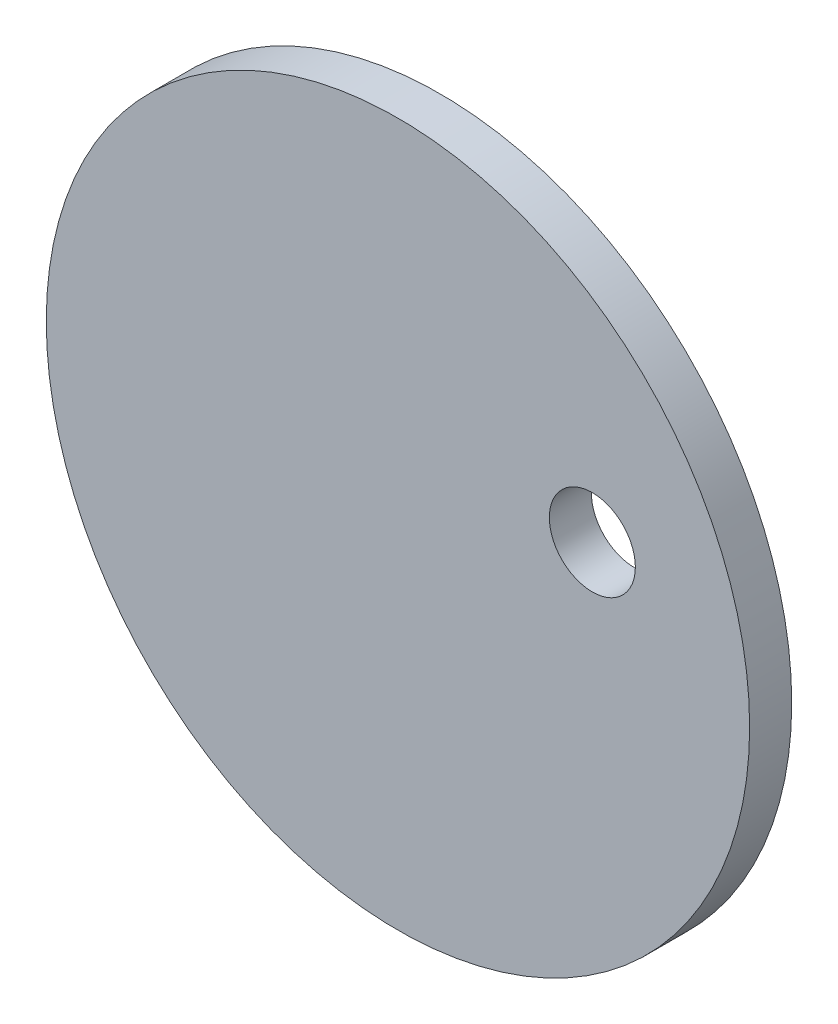
ISO-10303-21;
HEADER;
FILE_DESCRIPTION(('STEP AP214'),'2;1');
FILE_NAME('part.step','',(''),(''),'','','');
FILE_SCHEMA(('AUTOMOTIVE_DESIGN { 1 0 10303 214 1 1 1 1 }'));
ENDSEC;
DATA;
#1=APPLICATION_CONTEXT('core data for automotive mechanical design processes');
#2=APPLICATION_PROTOCOL_DEFINITION('international standard','automotive_design',2000,#1);
#3=PRODUCT_CONTEXT('',#1,'mechanical');
#4=PRODUCT('Part','Part','',(#3));
#5=PRODUCT_RELATED_PRODUCT_CATEGORY('part','',(#4));
#6=PRODUCT_DEFINITION_FORMATION('','',#4);
#7=PRODUCT_DEFINITION_CONTEXT('part definition',#1,'design');
#8=PRODUCT_DEFINITION('design','',#6,#7);
#9=PRODUCT_DEFINITION_SHAPE('','',#8);
#10=(LENGTH_UNIT() NAMED_UNIT(*) SI_UNIT(.MILLI.,.METRE.));
#11=(NAMED_UNIT(*) PLANE_ANGLE_UNIT() SI_UNIT($,.RADIAN.));
#12=(NAMED_UNIT(*) SI_UNIT($,.STERADIAN.) SOLID_ANGLE_UNIT());
#13=UNCERTAINTY_MEASURE_WITH_UNIT(LENGTH_MEASURE(1.E-05),#10,'distance_accuracy_value','');
#14=(GEOMETRIC_REPRESENTATION_CONTEXT(3) GLOBAL_UNCERTAINTY_ASSIGNED_CONTEXT((#13)) GLOBAL_UNIT_ASSIGNED_CONTEXT((#10,
#11,#12)) REPRESENTATION_CONTEXT('',''));
#15=CARTESIAN_POINT('',(0.,0.,0.));
#16=DIRECTION('',(0.,0.,1.));
#17=DIRECTION('',(1.,0.,0.));
#18=AXIS2_PLACEMENT_3D('',#15,#16,#17);
#19=CARTESIAN_POINT('',(0.,0.,-9.14399999999999));
#20=DIRECTION('',(0.,0.,1.));
#21=DIRECTION('',(1.,0.,0.));
#22=AXIS2_PLACEMENT_3D('',#19,#20,#21);
#23=CYLINDRICAL_SURFACE('',#22,76.4143212356991);
#24=CARTESIAN_POINT('',(0.,0.,-9.14399999999999));
#25=DIRECTION('',(0.,0.,1.));
#26=DIRECTION('',(1.,0.,0.));
#27=AXIS2_PLACEMENT_3D('',#24,#25,#26);
#28=CIRCLE('',#27,76.4143212356991);
#29=CARTESIAN_POINT('',(76.4143212356991,0.,-9.14399999999999));
#30=VERTEX_POINT('',#29);
#31=EDGE_CURVE('E10',#30,#30,#28,.T.);
#32=ORIENTED_EDGE('',*,*,#31,.T.);
#33=EDGE_LOOP('',(#32));
#34=FACE_BOUND('',#33,.T.);
#35=CARTESIAN_POINT('',(0.,0.,0.));
#36=DIRECTION('',(0.,0.,1.));
#37=DIRECTION('',(1.,0.,0.));
#38=AXIS2_PLACEMENT_3D('',#35,#36,#37);
#39=CIRCLE('',#38,76.4143212356991);
#40=CARTESIAN_POINT('',(76.4143212356991,0.,0.));
#41=VERTEX_POINT('',#40);
#42=EDGE_CURVE('E32',#41,#41,#39,.T.);
#43=ORIENTED_EDGE('',*,*,#42,.F.);
#44=EDGE_LOOP('',(#43));
#45=FACE_BOUND('',#44,.T.);
#46=ADVANCED_FACE('F29',(#34,#45),#23,.T.);
#47=CARTESIAN_POINT('',(0.,0.,-9.14399999999999));
#48=DIRECTION('',(0.,0.,1.));
#49=DIRECTION('',(1.,0.,0.));
#50=AXIS2_PLACEMENT_3D('',#47,#48,#49);
#51=PLANE('',#50);
#52=CARTESIAN_POINT('',(42.2342528985693,17.7047835990888,-9.14399999999999));
#53=DIRECTION('',(0.,0.,1.));
#54=DIRECTION('',(1.,0.,0.));
#55=AXIS2_PLACEMENT_3D('',#52,#53,#54);
#56=CIRCLE('',#55,9.3474263073092);
#57=CARTESIAN_POINT('',(51.5816792058785,17.7047835990888,-9.14399999999999));
#58=VERTEX_POINT('',#57);
#59=EDGE_CURVE('E39',#58,#58,#56,.T.);
#60=ORIENTED_EDGE('',*,*,#59,.T.);
#61=EDGE_LOOP('',(#60));
#62=FACE_BOUND('',#61,.T.);
#63=ORIENTED_EDGE('',*,*,#31,.F.);
#64=EDGE_LOOP('',(#63));
#65=FACE_BOUND('',#64,.T.);
#66=ADVANCED_FACE('F47',(#62,#65),#51,.F.);
#67=CARTESIAN_POINT('',(0.,0.,0.));
#68=DIRECTION('',(0.,0.,1.));
#69=DIRECTION('',(1.,0.,0.));
#70=AXIS2_PLACEMENT_3D('',#67,#68,#69);
#71=PLANE('',#70);
#72=CARTESIAN_POINT('',(42.2342528985693,17.7047835990888,0.));
#73=DIRECTION('',(0.,0.,1.));
#74=DIRECTION('',(1.,0.,0.));
#75=AXIS2_PLACEMENT_3D('',#72,#73,#74);
#76=CIRCLE('',#75,9.3474263073092);
#77=CARTESIAN_POINT('',(51.5816792058785,17.7047835990888,0.));
#78=VERTEX_POINT('',#77);
#79=EDGE_CURVE('E41',#78,#78,#76,.T.);
#80=ORIENTED_EDGE('',*,*,#79,.F.);
#81=EDGE_LOOP('',(#80));
#82=FACE_BOUND('',#81,.T.);
#83=ORIENTED_EDGE('',*,*,#42,.T.);
#84=EDGE_LOOP('',(#83));
#85=FACE_BOUND('',#84,.T.);
#86=ADVANCED_FACE('F53',(#82,#85),#71,.T.);
#87=CARTESIAN_POINT('',(42.2342528985693,17.7047835990888,-9.14399999999999));
#88=DIRECTION('',(0.,0.,1.));
#89=DIRECTION('',(1.,0.,0.));
#90=AXIS2_PLACEMENT_3D('',#87,#88,#89);
#91=CYLINDRICAL_SURFACE('',#90,9.3474263073092);
#92=ORIENTED_EDGE('',*,*,#59,.F.);
#93=EDGE_LOOP('',(#92));
#94=FACE_BOUND('',#93,.T.);
#95=ORIENTED_EDGE('',*,*,#79,.T.);
#96=EDGE_LOOP('',(#95));
#97=FACE_BOUND('',#96,.T.);
#98=ADVANCED_FACE('F50',(#94,#97),#91,.F.);
#99=CLOSED_SHELL('',(#46,#66,#86,#98));
#100=MANIFOLD_SOLID_BREP('B2',#99);
#101=ADVANCED_BREP_SHAPE_REPRESENTATION('',(#18,#100),#14);
#102=SHAPE_DEFINITION_REPRESENTATION(#9,#101);
ENDSEC;
END-ISO-10303-21;
